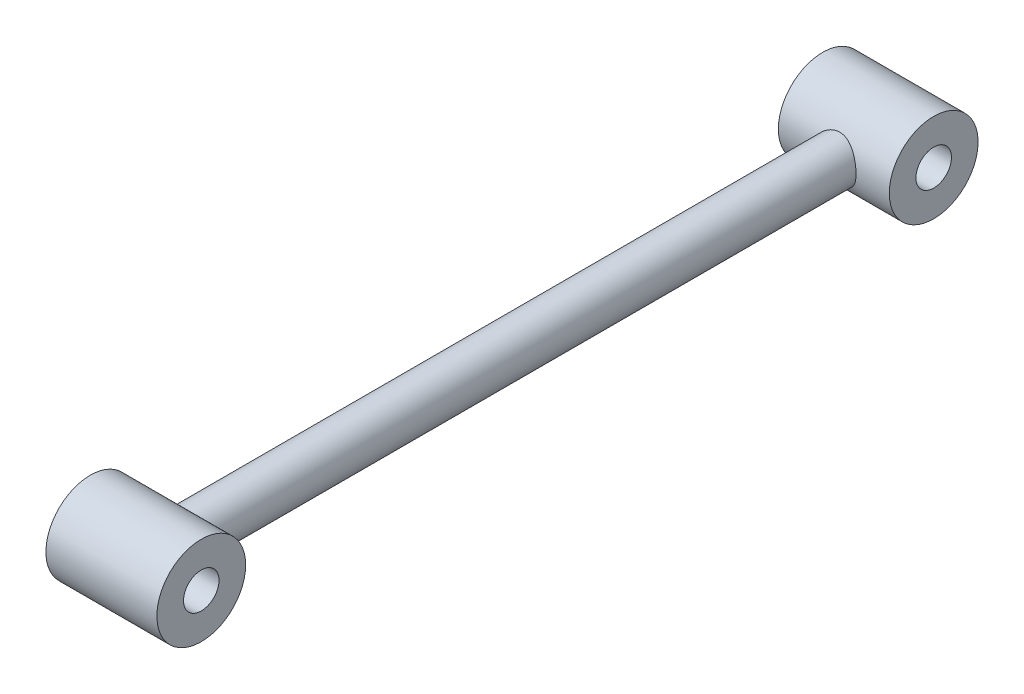
ISO-10303-21;
HEADER;
FILE_DESCRIPTION(('STEP AP214'),'2;1');
FILE_NAME('part.step','',(''),(''),'','','');
FILE_SCHEMA(('AUTOMOTIVE_DESIGN { 1 0 10303 214 1 1 1 1 }'));
ENDSEC;
DATA;
#1=APPLICATION_CONTEXT('core data for automotive mechanical design processes');
#2=APPLICATION_PROTOCOL_DEFINITION('international standard','automotive_design',2000,#1);
#3=PRODUCT_CONTEXT('',#1,'mechanical');
#4=PRODUCT('Part','Part','',(#3));
#5=PRODUCT_RELATED_PRODUCT_CATEGORY('part','',(#4));
#6=PRODUCT_DEFINITION_FORMATION('','',#4);
#7=PRODUCT_DEFINITION_CONTEXT('part definition',#1,'design');
#8=PRODUCT_DEFINITION('design','',#6,#7);
#9=PRODUCT_DEFINITION_SHAPE('','',#8);
#10=(LENGTH_UNIT() NAMED_UNIT(*) SI_UNIT(.MILLI.,.METRE.));
#11=(NAMED_UNIT(*) PLANE_ANGLE_UNIT() SI_UNIT($,.RADIAN.));
#12=(NAMED_UNIT(*) SI_UNIT($,.STERADIAN.) SOLID_ANGLE_UNIT());
#13=UNCERTAINTY_MEASURE_WITH_UNIT(LENGTH_MEASURE(1.E-05),#10,'distance_accuracy_value','');
#14=(GEOMETRIC_REPRESENTATION_CONTEXT(3) GLOBAL_UNCERTAINTY_ASSIGNED_CONTEXT((#13)) GLOBAL_UNIT_ASSIGNED_CONTEXT((#10,
#11,#12)) REPRESENTATION_CONTEXT('',''));
#15=CARTESIAN_POINT('',(0.,0.,0.));
#16=DIRECTION('',(0.,0.,1.));
#17=DIRECTION('',(1.,0.,0.));
#18=AXIS2_PLACEMENT_3D('',#15,#16,#17);
#19=CARTESIAN_POINT('',(0.,0.,165.));
#20=DIRECTION('',(0.,0.,-1.));
#21=DIRECTION('',(-1.,0.,0.));
#22=AXIS2_PLACEMENT_3D('',#19,#20,#21);
#23=CYLINDRICAL_SURFACE('',#22,5.);
#24=CARTESIAN_POINT('',(-5.,0.,10.));
#25=CARTESIAN_POINT('',(-4.99999956778397,-0.131488890078729,9.99999960171886));
#26=CARTESIAN_POINT('',(-4.99480722471488,-0.262986970217151,9.99740053121285));
#27=CARTESIAN_POINT('',(-4.97409710588797,-0.525014586348056,9.98706977835169));
#28=CARTESIAN_POINT('',(-4.95857483823602,-0.655543676003294,9.97933586314932));
#29=CARTESIAN_POINT('',(-4.91735922052266,-0.914783203431133,9.95892066969003));
#30=CARTESIAN_POINT('',(-4.89165136559376,-1.04349077535257,9.94623233642882));
#31=CARTESIAN_POINT('',(-4.83034932743654,-1.29802636754293,9.91622716576672));
#32=CARTESIAN_POINT('',(-4.79475110259437,-1.42385318781692,9.89890843630384));
#33=CARTESIAN_POINT('',(-4.7142215175487,-1.67121386584967,9.86015430154805));
#34=CARTESIAN_POINT('',(-4.66933135145195,-1.79276399094561,9.83873709670759));
#35=CARTESIAN_POINT('',(-4.57055120219305,-2.0314444775119,9.79224427489325));
#36=CARTESIAN_POINT('',(-4.51665783180655,-2.14857315511665,9.76716728146841));
#37=CARTESIAN_POINT('',(-4.34220037106102,-2.49222561412914,9.68730860488737));
#38=CARTESIAN_POINT('',(-4.20876922675994,-2.71128846115304,9.62785460216171));
#39=CARTESIAN_POINT('',(-3.90239471875545,-3.13758045755123,9.49780663424162));
#40=CARTESIAN_POINT('',(-3.72754930972028,-3.34329192972867,9.42675632671348));
#41=CARTESIAN_POINT('',(-3.34741091171685,-3.72388133818108,9.28300214475255));
#42=CARTESIAN_POINT('',(-3.14209493801615,-3.89873577832563,9.21029705743544));
#43=CARTESIAN_POINT('',(-2.68752485253572,-4.22628385620054,9.06493867332994));
#44=CARTESIAN_POINT('',(-2.43609810868252,-4.37620734766694,8.99272664170302));
#45=CARTESIAN_POINT('',(-2.04008195563241,-4.56723365243868,8.89637417546678));
#46=CARTESIAN_POINT('',(-1.90488170943973,-4.62527981130997,8.8662427968472));
#47=CARTESIAN_POINT('',(-1.62899874822594,-4.72948843578256,8.81109611627223));
#48=CARTESIAN_POINT('',(-1.48831933636083,-4.77565793744269,8.78607778701963));
#49=CARTESIAN_POINT('',(-1.21100724584403,-4.8531380584616,8.74350562362059));
#50=CARTESIAN_POINT('',(-1.07462952002207,-4.88516762296958,8.72559704108877));
#51=CARTESIAN_POINT('',(-0.799074302520378,-4.93772573892405,8.69596333711107));
#52=CARTESIAN_POINT('',(-0.659898336993894,-4.95826039236648,8.68423493515242));
#53=CARTESIAN_POINT('',(-0.379992538888764,-4.98752398958936,8.66746161087016));
#54=CARTESIAN_POINT('',(-0.239263693685896,-4.99626004329765,8.66241266349289));
#55=CARTESIAN_POINT('',(0.0425011762896065,-5.00180399494054,8.65921299638946));
#56=CARTESIAN_POINT('',(0.18353717047138,-4.99861303092503,8.6610616185123));
#57=CARTESIAN_POINT('',(0.447703572876951,-4.98145803092846,8.67093727173594));
#58=CARTESIAN_POINT('',(0.570952602810202,-4.96883208371091,8.67819663501131));
#59=CARTESIAN_POINT('',(0.815821213967111,-4.93454402662215,8.69773906996624));
#60=CARTESIAN_POINT('',(0.937440271021948,-4.91287907868334,8.71002371946269));
#61=CARTESIAN_POINT('',(1.17819787431277,-4.86076278292653,8.7392147957695));
#62=CARTESIAN_POINT('',(1.29733672485003,-4.83031251988904,8.75612065195562));
#63=CARTESIAN_POINT('',(1.5324713769544,-4.76094319159973,8.79403073984607));
#64=CARTESIAN_POINT('',(1.64846592327607,-4.72202079856857,8.81503658165343));
#65=CARTESIAN_POINT('',(1.99600687161863,-4.59108661358501,8.88436032421637));
#66=CARTESIAN_POINT('',(2.22169335603786,-4.48608785825886,8.93828791833522));
#67=CARTESIAN_POINT('',(2.65321011822285,-4.24519591002764,9.05517433078603));
#68=CARTESIAN_POINT('',(2.85903141775921,-4.10928884013355,9.11813720101033));
#69=CARTESIAN_POINT('',(3.27258852820379,-3.79034422310328,9.25565455759081));
#70=CARTESIAN_POINT('',(3.4772580077073,-3.60351571642877,9.33066654203131));
#71=CARTESIAN_POINT('',(3.85370346568872,-3.19773444843253,9.47739013910052));
#72=CARTESIAN_POINT('',(4.02546372382122,-2.97876642220598,9.54910016205802));
#73=CARTESIAN_POINT('',(4.25844089711319,-2.62430600098781,9.65034506582223));
#74=CARTESIAN_POINT('',(4.33335209514551,-2.49871002336159,9.68370380274257));
#75=CARTESIAN_POINT('',(4.47220820297243,-2.2407106014256,9.74663052718474));
#76=CARTESIAN_POINT('',(4.53615773559115,-2.1083100575541,9.77620011135784));
#77=CARTESIAN_POINT('',(4.65239887538339,-1.83762803314804,9.83067553510547));
#78=CARTESIAN_POINT('',(4.70469517552479,-1.69934894682179,9.85558325144947));
#79=CARTESIAN_POINT('',(4.79702492907996,-1.41791187896084,9.89999026457504));
#80=CARTESIAN_POINT('',(4.83705979318215,-1.27475446078987,9.91949018350379));
#81=CARTESIAN_POINT('',(4.90153356350301,-0.996798015430413,9.95109597328193));
#82=CARTESIAN_POINT('',(4.92698951540243,-0.862288674029799,9.96368046334327));
#83=CARTESIAN_POINT('',(4.9668080412236,-0.591248360012468,9.98343035732269));
#84=CARTESIAN_POINT('',(4.98117159579009,-0.454717567193954,9.99059624028199));
#85=CARTESIAN_POINT('',(4.99861316203406,-0.180810709359649,9.99930380487356));
#86=CARTESIAN_POINT('',(5.00169549426692,-0.0434349881359015,10.000847639673));
#87=CARTESIAN_POINT('',(4.99654442608125,0.231047608581549,9.9982723785904));
#88=CARTESIAN_POINT('',(4.98831152645069,0.368154495704338,9.99415353332645));
#89=CARTESIAN_POINT('',(4.96172132615896,0.630324023952244,9.98090973082446));
#90=CARTESIAN_POINT('',(4.94420162240662,0.755493751243217,9.97219922243106));
#91=CARTESIAN_POINT('',(4.89982552642939,1.00380426086804,9.95027227352717));
#92=CARTESIAN_POINT('',(4.87296617690675,1.12694438760008,9.93705440583579));
#93=CARTESIAN_POINT('',(4.81019731663748,1.37032307172126,9.90642450404115));
#94=CARTESIAN_POINT('',(4.77429057532187,1.49056250470176,9.88901375346269));
#95=CARTESIAN_POINT('',(4.69377183867682,1.72747946867538,9.85039368148874));
#96=CARTESIAN_POINT('',(4.64915650864734,1.84415561535681,9.8291829052407));
#97=CARTESIAN_POINT('',(4.5000521931497,2.19430354472275,9.75922876416582));
#98=CARTESIAN_POINT('',(4.38205925821493,2.42111320848944,9.7050490447818));
#99=CARTESIAN_POINT('',(4.1144478067803,2.8523456015808,9.58719375745592));
#100=CARTESIAN_POINT('',(3.96481581800769,3.05675873773466,9.52351414776381));
#101=CARTESIAN_POINT('',(3.62121270896337,3.45882132675025,9.38541505392105));
#102=CARTESIAN_POINT('',(3.42433040824756,3.65383533419946,9.31055499361996));
#103=CARTESIAN_POINT('',(3.00032946286605,4.00930667677967,9.16310881759144));
#104=CARTESIAN_POINT('',(2.77319007600167,4.16974010650665,9.09052430437333));
#105=CARTESIAN_POINT('',(2.40750943377075,4.38466016919211,8.98785260582619));
#106=CARTESIAN_POINT('',(2.27814912545653,4.4532676226712,8.95395955241384));
#107=CARTESIAN_POINT('',(2.01310589922104,4.57918112262683,8.8902235241508));
#108=CARTESIAN_POINT('',(1.87742587962408,4.63649228788887,8.8603787168037));
#109=CARTESIAN_POINT('',(1.60072296467476,4.73913999074898,8.80590327365629));
#110=CARTESIAN_POINT('',(1.45970454424996,4.78448631442401,8.7812683799473));
#111=CARTESIAN_POINT('',(1.17330895717519,4.86265004333096,8.73822819098158));
#112=CARTESIAN_POINT('',(1.02793246917246,4.89546938847111,8.71982193121851));
#113=CARTESIAN_POINT('',(0.748235018464722,4.94553834792943,8.69151275671388));
#114=CARTESIAN_POINT('',(0.614192116880048,4.96397997433445,8.68096327035261));
#115=CARTESIAN_POINT('',(0.344714754302619,4.98993873206132,8.66606824539578));
#116=CARTESIAN_POINT('',(0.209280440604789,4.99745700797003,8.66172205679784));
#117=CARTESIAN_POINT('',(-0.0617569250046254,5.00145477351748,8.65941425656732));
#118=CARTESIAN_POINT('',(-0.197359900849616,4.99793814327598,8.66145040076355));
#119=CARTESIAN_POINT('',(-0.467585557947871,4.97992974203946,8.67181681785817));
#120=CARTESIAN_POINT('',(-0.602208279104532,4.96543842034336,8.68014683308829));
#121=CARTESIAN_POINT('',(-0.856560202159012,4.92759757627216,8.70167828744802));
#122=CARTESIAN_POINT('',(-0.976482559623928,4.90522766015,8.71433770908854));
#123=CARTESIAN_POINT('',(-1.21386119056747,4.85194376743193,8.74411599480517));
#124=CARTESIAN_POINT('',(-1.33131668933404,4.82102714868722,8.76123623781643));
#125=CARTESIAN_POINT('',(-1.6789171151129,4.71590306073959,8.81854231868726));
#126=CARTESIAN_POINT('',(-1.904456094986,4.62929708984156,8.8646881377113));
#127=CARTESIAN_POINT('',(-2.35316034231251,4.4190716467502,8.97142890954606));
#128=CARTESIAN_POINT('',(-2.57514807598935,4.29335633682031,9.0327863364739));
#129=CARTESIAN_POINT('',(-2.99636410959572,4.01075421010744,9.16176636495221));
#130=CARTESIAN_POINT('',(-3.19558048344417,3.85385117607732,9.22939221620457));
#131=CARTESIAN_POINT('',(-3.59070785847072,3.49102748964406,9.3731144460079));
#132=CARTESIAN_POINT('',(-3.78327601876762,3.28146736342599,9.44924162905913));
#133=CARTESIAN_POINT('',(-4.13133442118328,2.83072875767414,9.59389514971536));
#134=CARTESIAN_POINT('',(-4.28680467774357,2.58953334336126,9.66241737976038));
#135=CARTESIAN_POINT('',(-4.48863041452682,2.20753881885374,9.75419013375831));
#136=CARTESIAN_POINT('',(-4.55086707940638,2.0762551257027,9.78304209980294));
#137=CARTESIAN_POINT('',(-4.66393615612038,1.80799529933999,9.83614745234556));
#138=CARTESIAN_POINT('',(-4.71477417053061,1.67102200205151,9.86040309707971));
#139=CARTESIAN_POINT('',(-4.80434543836719,1.39269501068688,9.90354484128719));
#140=CARTESIAN_POINT('',(-4.84310509298771,1.25135162347081,9.92244264379386));
#141=CARTESIAN_POINT('',(-4.90813759626857,0.965237205795556,9.95434618112012));
#142=CARTESIAN_POINT('',(-4.93441807252703,0.820468326048372,9.96735551489676));
#143=CARTESIAN_POINT('',(-4.96947453199886,0.563041654408159,9.98476387878719));
#144=CARTESIAN_POINT('',(-4.98091175369202,0.450825809730024,9.99046741601667));
#145=CARTESIAN_POINT('',(-4.99617477825015,0.225742246050265,9.99808569986016));
#146=CARTESIAN_POINT('',(-5.00000037102885,0.112874509142188,10.000000341898));
#147=CARTESIAN_POINT('',(-5.,0.,10.));
#148=B_SPLINE_CURVE_WITH_KNOTS('',3,(#24,#25,#26,#27,#28,#29,#30,#31,#32,#33,#34,#35,#36,#37,
#38,#39,#40,#41,#42,#43,#44,#45,#46,#47,#48,#49,#50,#51,#52,#53,#54,#55,#56,#57,#58,#59,#60,#61,
#62,#63,#64,#65,#66,#67,#68,#69,#70,#71,#72,#73,#74,#75,#76,#77,#78,#79,#80,#81,#82,#83,#84,#85,
#86,#87,#88,#89,#90,#91,#92,#93,#94,#95,#96,#97,#98,#99,#100,#101,#102,#103,#104,#105,#106,#107,
#108,#109,#110,#111,#112,#113,#114,#115,#116,#117,#118,#119,#120,#121,#122,#123,#124,#125,#126,
#127,#128,#129,#130,#131,#132,#133,#134,#135,#136,#137,#138,#139,#140,#141,#142,#143,#144,#145,
#146,#147),.UNSPECIFIED.,.T.,.F.,(4,2,2,2,2,2,2,2,2,2,2,2,2,2,2,2,2,2,2,2,2,2,2,2,2,2,2,2,2,2,2,
2,2,2,2,2,2,2,2,2,2,2,2,2,2,2,2,2,2,2,2,2,2,2,2,2,2,2,2,2,2,4),(0.,0.39435529464989,
0.788882184037817,1.18397293369035,1.57922537181693,1.97276168530542,2.36644639154631,
3.15295441699266,3.98704440767527,4.821766802355,5.72122193562246,6.17125359989459,
6.62101803579305,7.04410338623952,7.46696393118358,7.88956954321097,8.31213483216671,
8.68401534897463,9.05601271689169,9.42796417149685,9.8000619899096,10.56083380205,
11.3219478566368,12.1795688603196,13.03759852356,13.4870830845772,13.9363776171859,
14.3854908824168,14.8345524573652,15.2464230691107,15.6582572644723,16.0699337163998,
16.4815919489941,16.8612200640511,17.240968493866,17.6206008225791,18.0003788066131,
18.7808755264614,19.5617052624835,20.4192132572739,21.2773121558255,21.7277011924366,
22.1778856687596,22.6277007885002,23.0774462222894,23.4840267197959,23.8905646113036,
24.2969595710184,24.703337894006,25.0708552370355,25.4384863225851,26.1732662495599,
26.9574126491567,27.7419678673239,28.6218519479817,29.5022089791541,29.9460734671028,
30.3897193096443,30.8323885049027,31.2747867798493,31.6133053554877,31.9518332743451),.UNSPECIFIED.);
#149=CARTESIAN_POINT('',(-5.,0.,10.));
#150=VERTEX_POINT('',#149);
#151=EDGE_CURVE('E45',#150,#150,#148,.T.);
#152=ORIENTED_EDGE('',*,*,#151,.T.);
#153=EDGE_LOOP('',(#152));
#154=FACE_BOUND('',#153,.T.);
#155=CARTESIAN_POINT('',(-5.,0.,155.));
#156=CARTESIAN_POINT('',(-4.99999956778397,0.131488890078729,155.000000398281));
#157=CARTESIAN_POINT('',(-4.99480722471488,0.262986970217151,155.002599468787));
#158=CARTESIAN_POINT('',(-4.97409710588797,0.525014586348056,155.012930221648));
#159=CARTESIAN_POINT('',(-4.95857483823602,0.655543676003295,155.020664136851));
#160=CARTESIAN_POINT('',(-4.91735922052266,0.914783203431134,155.04107933031));
#161=CARTESIAN_POINT('',(-4.89165136559376,1.04349077535257,155.053767663571));
#162=CARTESIAN_POINT('',(-4.83034932743654,1.29802636754293,155.083772834233));
#163=CARTESIAN_POINT('',(-4.79475110259437,1.42385318781692,155.101091563696));
#164=CARTESIAN_POINT('',(-4.7142215175487,1.67121386584967,155.139845698452));
#165=CARTESIAN_POINT('',(-4.66933135145195,1.79276399094562,155.161262903292));
#166=CARTESIAN_POINT('',(-4.57055120219305,2.0314444775119,155.207755725107));
#167=CARTESIAN_POINT('',(-4.51665783180655,2.14857315511666,155.232832718532));
#168=CARTESIAN_POINT('',(-4.34220037106102,2.49222561412914,155.312691395113));
#169=CARTESIAN_POINT('',(-4.20876922675994,2.71128846115304,155.372145397838));
#170=CARTESIAN_POINT('',(-3.90239471875545,3.13758045755124,155.502193365758));
#171=CARTESIAN_POINT('',(-3.72754930972029,3.34329192972867,155.573243673287));
#172=CARTESIAN_POINT('',(-3.34741091171685,3.72388133818107,155.716997855247));
#173=CARTESIAN_POINT('',(-3.14209493801615,3.89873577832562,155.789702942565));
#174=CARTESIAN_POINT('',(-2.68752485253572,4.22628385620054,155.93506132667));
#175=CARTESIAN_POINT('',(-2.43609810868252,4.37620734766693,156.007273358297));
#176=CARTESIAN_POINT('',(-2.04008195563241,4.56723365243868,156.103625824533));
#177=CARTESIAN_POINT('',(-1.90488170943973,4.62527981130997,156.133757203153));
#178=CARTESIAN_POINT('',(-1.62899874822593,4.72948843578257,156.188903883728));
#179=CARTESIAN_POINT('',(-1.48831933636082,4.77565793744269,156.21392221298));
#180=CARTESIAN_POINT('',(-1.21100724584402,4.8531380584616,156.256494376379));
#181=CARTESIAN_POINT('',(-1.07462952002206,4.88516762296958,156.274402958911));
#182=CARTESIAN_POINT('',(-0.799074302520372,4.93772573892405,156.304036662889));
#183=CARTESIAN_POINT('',(-0.659898336993889,4.95826039236648,156.315765064848));
#184=CARTESIAN_POINT('',(-0.37999253888876,4.98752398958936,156.33253838913));
#185=CARTESIAN_POINT('',(-0.239263693685894,4.99626004329765,156.337587336507));
#186=CARTESIAN_POINT('',(0.042501176289607,5.00180399494054,156.340787003611));
#187=CARTESIAN_POINT('',(0.183537170471381,4.99861303092503,156.338938381488));
#188=CARTESIAN_POINT('',(0.447703572876951,4.98145803092846,156.329062728264));
#189=CARTESIAN_POINT('',(0.5709526028102,4.96883208371091,156.321803364989));
#190=CARTESIAN_POINT('',(0.815821213967109,4.93454402662215,156.302260930034));
#191=CARTESIAN_POINT('',(0.937440271021948,4.91287907868334,156.289976280537));
#192=CARTESIAN_POINT('',(1.17819787431277,4.86076278292653,156.260785204231));
#193=CARTESIAN_POINT('',(1.29733672485003,4.83031251988904,156.243879348044));
#194=CARTESIAN_POINT('',(1.53247137695439,4.76094319159973,156.205969260154));
#195=CARTESIAN_POINT('',(1.64846592327607,4.72202079856857,156.184963418347));
#196=CARTESIAN_POINT('',(1.99600687161863,4.59108661358501,156.115639675784));
#197=CARTESIAN_POINT('',(2.22169335603786,4.48608785825886,156.061712081665));
#198=CARTESIAN_POINT('',(2.65321011822286,4.24519591002764,155.944825669214));
#199=CARTESIAN_POINT('',(2.85903141775921,4.10928884013355,155.88186279899));
#200=CARTESIAN_POINT('',(3.27258852820379,3.79034422310328,155.744345442409));
#201=CARTESIAN_POINT('',(3.4772580077073,3.60351571642877,155.669333457969));
#202=CARTESIAN_POINT('',(3.85370346568872,3.19773444843253,155.522609860899));
#203=CARTESIAN_POINT('',(4.02546372382122,2.97876642220598,155.450899837942));
#204=CARTESIAN_POINT('',(4.25844089711319,2.62430600098782,155.349654934178));
#205=CARTESIAN_POINT('',(4.33335209514551,2.49871002336159,155.316296197257));
#206=CARTESIAN_POINT('',(4.47220820297243,2.24071060142561,155.253369472815));
#207=CARTESIAN_POINT('',(4.53615773559115,2.1083100575541,155.223799888642));
#208=CARTESIAN_POINT('',(4.65239887538339,1.83762803314804,155.169324464895));
#209=CARTESIAN_POINT('',(4.70469517552479,1.69934894682179,155.144416748551));
#210=CARTESIAN_POINT('',(4.79702492907996,1.41791187896083,155.100009735425));
#211=CARTESIAN_POINT('',(4.83705979318215,1.27475446078987,155.080509816496));
#212=CARTESIAN_POINT('',(4.90153356350302,0.996798015430414,155.048904026718));
#213=CARTESIAN_POINT('',(4.92698951540243,0.862288674029799,155.036319536657));
#214=CARTESIAN_POINT('',(4.9668080412236,0.591248360012467,155.016569642677));
#215=CARTESIAN_POINT('',(4.98117159579009,0.454717567193953,155.009403759718));
#216=CARTESIAN_POINT('',(4.99861316203406,0.180810709359648,155.000696195126));
#217=CARTESIAN_POINT('',(5.00169549426692,0.0434349881359,154.999152360327));
#218=CARTESIAN_POINT('',(4.99654442608125,-0.231047608581551,155.00172762141));
#219=CARTESIAN_POINT('',(4.98831152645069,-0.36815449570434,155.005846466674));
#220=CARTESIAN_POINT('',(4.96172132615896,-0.630324023952245,155.019090269176));
#221=CARTESIAN_POINT('',(4.94420162240662,-0.755493751243218,155.027800777569));
#222=CARTESIAN_POINT('',(4.89982552642939,-1.00380426086804,155.049727726473));
#223=CARTESIAN_POINT('',(4.87296617690675,-1.12694438760008,155.062945594164));
#224=CARTESIAN_POINT('',(4.81019731663748,-1.37032307172126,155.093575495959));
#225=CARTESIAN_POINT('',(4.77429057532187,-1.49056250470176,155.110986246537));
#226=CARTESIAN_POINT('',(4.69377183867682,-1.72747946867538,155.149606318511));
#227=CARTESIAN_POINT('',(4.64915650864734,-1.84415561535682,155.170817094759));
#228=CARTESIAN_POINT('',(4.5000521931497,-2.19430354472275,155.240771235834));
#229=CARTESIAN_POINT('',(4.38205925821493,-2.42111320848944,155.294950955218));
#230=CARTESIAN_POINT('',(4.1144478067803,-2.8523456015808,155.412806242544));
#231=CARTESIAN_POINT('',(3.96481581800769,-3.05675873773467,155.476485852236));
#232=CARTESIAN_POINT('',(3.62121270896337,-3.45882132675025,155.614584946079));
#233=CARTESIAN_POINT('',(3.42433040824757,-3.65383533419945,155.68944500638));
#234=CARTESIAN_POINT('',(3.00032946286605,-4.00930667677967,155.836891182409));
#235=CARTESIAN_POINT('',(2.77319007600168,-4.16974010650665,155.909475695627));
#236=CARTESIAN_POINT('',(2.40750943377075,-4.38466016919211,156.012147394174));
#237=CARTESIAN_POINT('',(2.27814912545654,-4.45326762267119,156.046040447586));
#238=CARTESIAN_POINT('',(2.01310589922105,-4.57918112262683,156.109776475849));
#239=CARTESIAN_POINT('',(1.87742587962409,-4.63649228788886,156.139621283196));
#240=CARTESIAN_POINT('',(1.60072296467478,-4.73913999074898,156.194096726344));
#241=CARTESIAN_POINT('',(1.45970454424998,-4.784486314424,156.218731620053));
#242=CARTESIAN_POINT('',(1.1733089571752,-4.86265004333096,156.261771809018));
#243=CARTESIAN_POINT('',(1.02793246917247,-4.89546938847111,156.280178068782));
#244=CARTESIAN_POINT('',(0.748235018464733,-4.94553834792942,156.308487243286));
#245=CARTESIAN_POINT('',(0.614192116880058,-4.96397997433445,156.319036729647));
#246=CARTESIAN_POINT('',(0.344714754302628,-4.98993873206132,156.333931754604));
#247=CARTESIAN_POINT('',(0.209280440604797,-4.99745700797003,156.338277943202));
#248=CARTESIAN_POINT('',(-0.0617569250046183,-5.00145477351748,156.340585743433));
#249=CARTESIAN_POINT('',(-0.19735990084961,-4.99793814327599,156.338549599236));
#250=CARTESIAN_POINT('',(-0.467585557947866,-4.97992974203946,156.328183182142));
#251=CARTESIAN_POINT('',(-0.602208279104527,-4.96543842034336,156.319853166912));
#252=CARTESIAN_POINT('',(-0.856560202159006,-4.92759757627216,156.298321712552));
#253=CARTESIAN_POINT('',(-0.976482559623921,-4.90522766015,156.285662290911));
#254=CARTESIAN_POINT('',(-1.21386119056747,-4.85194376743194,156.255884005195));
#255=CARTESIAN_POINT('',(-1.33131668933403,-4.82102714868723,156.238763762184));
#256=CARTESIAN_POINT('',(-1.6789171151129,-4.71590306073959,156.181457681313));
#257=CARTESIAN_POINT('',(-1.904456094986,-4.62929708984156,156.135311862289));
#258=CARTESIAN_POINT('',(-2.35316034231251,-4.4190716467502,156.028571090454));
#259=CARTESIAN_POINT('',(-2.57514807598935,-4.29335633682031,155.967213663526));
#260=CARTESIAN_POINT('',(-2.99636410959572,-4.01075421010744,155.838233635048));
#261=CARTESIAN_POINT('',(-3.19558048344417,-3.85385117607732,155.770607783795));
#262=CARTESIAN_POINT('',(-3.59070785847072,-3.49102748964406,155.626885553992));
#263=CARTESIAN_POINT('',(-3.78327601876762,-3.28146736342598,155.550758370941));
#264=CARTESIAN_POINT('',(-4.13133442118328,-2.83072875767414,155.406104850285));
#265=CARTESIAN_POINT('',(-4.28680467774357,-2.58953334336126,155.33758262024));
#266=CARTESIAN_POINT('',(-4.48863041452682,-2.20753881885373,155.245809866242));
#267=CARTESIAN_POINT('',(-4.55086707940638,-2.0762551257027,155.216957900197));
#268=CARTESIAN_POINT('',(-4.66393615612038,-1.80799529933998,155.163852547654));
#269=CARTESIAN_POINT('',(-4.71477417053062,-1.67102200205151,155.13959690292));
#270=CARTESIAN_POINT('',(-4.80434543836719,-1.39269501068688,155.096455158713));
#271=CARTESIAN_POINT('',(-4.84310509298771,-1.25135162347081,155.077557356206));
#272=CARTESIAN_POINT('',(-4.90813759626857,-0.965237205795555,155.04565381888));
#273=CARTESIAN_POINT('',(-4.93441807252703,-0.820468326048371,155.032644485103));
#274=CARTESIAN_POINT('',(-4.96947453199886,-0.563041654408157,155.015236121213));
#275=CARTESIAN_POINT('',(-4.98091175369202,-0.450825809730023,155.009532583983));
#276=CARTESIAN_POINT('',(-4.99617477825015,-0.225742246050264,155.00191430014));
#277=CARTESIAN_POINT('',(-5.00000037102885,-0.112874509142187,154.999999658102));
#278=CARTESIAN_POINT('',(-5.,0.,155.));
#279=B_SPLINE_CURVE_WITH_KNOTS('',3,(#155,#156,#157,#158,#159,#160,#161,#162,#163,#164,#165,
#166,#167,#168,#169,#170,#171,#172,#173,#174,#175,#176,#177,#178,#179,#180,#181,#182,#183,#184,
#185,#186,#187,#188,#189,#190,#191,#192,#193,#194,#195,#196,#197,#198,#199,#200,#201,#202,#203,
#204,#205,#206,#207,#208,#209,#210,#211,#212,#213,#214,#215,#216,#217,#218,#219,#220,#221,#222,
#223,#224,#225,#226,#227,#228,#229,#230,#231,#232,#233,#234,#235,#236,#237,#238,#239,#240,#241,
#242,#243,#244,#245,#246,#247,#248,#249,#250,#251,#252,#253,#254,#255,#256,#257,#258,#259,#260,
#261,#262,#263,#264,#265,#266,#267,#268,#269,#270,#271,#272,#273,#274,#275,#276,#277,#278),
.UNSPECIFIED.,.T.,.F.,(4,2,2,2,2,2,2,2,2,2,2,2,2,2,2,2,2,2,2,2,2,2,2,2,2,2,2,2,2,2,2,2,2,2,2,2,
2,2,2,2,2,2,2,2,2,2,2,2,2,2,2,2,2,2,2,2,2,2,2,2,2,4),(0.,0.394355294649889,0.788882184037818,
1.18397293369035,1.57922537181693,1.97276168530542,2.36644639154632,3.15295441699266,
3.98704440767526,4.82176680235499,5.72122193562246,6.17125359989459,6.62101803579306,
7.04410338623953,7.46696393118359,7.88956954321097,8.3121348321667,8.68401534897462,
9.05601271689169,9.42796417149685,9.8000619899096,10.56083380205,11.3219478566368,
12.1795688603196,13.03759852356,13.4870830845772,13.9363776171859,14.3854908824168,
14.8345524573652,15.2464230691107,15.6582572644723,16.0699337163998,16.4815919489941,
16.8612200640511,17.240968493866,17.6206008225791,18.0003788066131,18.7808755264614,
19.5617052624835,20.4192132572739,21.2773121558255,21.7277011924365,22.1778856687596,
22.6277007885002,23.0774462222894,23.4840267197959,23.8905646113036,24.2969595710184,
24.703337894006,25.0708552370355,25.4384863225851,26.1732662495599,26.9574126491567,
27.7419678673239,28.6218519479817,29.5022089791541,29.9460734671028,30.3897193096443,
30.8323885049027,31.2747867798493,31.6133053554877,31.9518332743451),.UNSPECIFIED.);
#280=CARTESIAN_POINT('',(-5.,0.,155.));
#281=VERTEX_POINT('',#280);
#282=EDGE_CURVE('E10',#281,#281,#279,.T.);
#283=ORIENTED_EDGE('',*,*,#282,.T.);
#284=EDGE_LOOP('',(#283));
#285=FACE_BOUND('',#284,.T.);
#286=ADVANCED_FACE('F41',(#154,#285),#23,.T.);
#287=CARTESIAN_POINT('',(-12.5,0.,165.));
#288=DIRECTION('',(1.,0.,0.));
#289=DIRECTION('',(0.,0.,-1.));
#290=AXIS2_PLACEMENT_3D('',#287,#288,#289);
#291=CYLINDRICAL_SURFACE('',#290,10.);
#292=CARTESIAN_POINT('',(-12.5,0.,165.));
#293=DIRECTION('',(1.,0.,0.));
#294=DIRECTION('',(0.,0.,-1.));
#295=AXIS2_PLACEMENT_3D('',#292,#293,#294);
#296=CIRCLE('',#295,10.);
#297=CARTESIAN_POINT('',(-12.5,0.,155.));
#298=VERTEX_POINT('',#297);
#299=EDGE_CURVE('E54',#298,#298,#296,.T.);
#300=ORIENTED_EDGE('',*,*,#299,.T.);
#301=EDGE_LOOP('',(#300));
#302=FACE_BOUND('',#301,.T.);
#303=CARTESIAN_POINT('',(12.5,0.,165.));
#304=DIRECTION('',(1.,0.,0.));
#305=DIRECTION('',(0.,0.,-1.));
#306=AXIS2_PLACEMENT_3D('',#303,#304,#305);
#307=CIRCLE('',#306,10.);
#308=CARTESIAN_POINT('',(12.5,0.,155.));
#309=VERTEX_POINT('',#308);
#310=EDGE_CURVE('E114',#309,#309,#307,.T.);
#311=ORIENTED_EDGE('',*,*,#310,.F.);
#312=EDGE_LOOP('',(#311));
#313=FACE_BOUND('',#312,.T.);
#314=ORIENTED_EDGE('',*,*,#282,.F.);
#315=EDGE_LOOP('',(#314));
#316=FACE_BOUND('',#315,.T.);
#317=ADVANCED_FACE('F65',(#302,#313,#316),#291,.T.);
#318=CARTESIAN_POINT('',(-12.5,0.,165.));
#319=DIRECTION('',(1.,0.,0.));
#320=DIRECTION('',(0.,0.,-1.));
#321=AXIS2_PLACEMENT_3D('',#318,#319,#320);
#322=PLANE('',#321);
#323=CARTESIAN_POINT('',(-12.5,0.,165.));
#324=DIRECTION('',(1.,0.,0.));
#325=DIRECTION('',(0.,0.,-1.));
#326=AXIS2_PLACEMENT_3D('',#323,#324,#325);
#327=CIRCLE('',#326,3.99999999999999);
#328=CARTESIAN_POINT('',(-12.5,0.,161.));
#329=VERTEX_POINT('',#328);
#330=EDGE_CURVE('E59',#329,#329,#327,.T.);
#331=ORIENTED_EDGE('',*,*,#330,.T.);
#332=EDGE_LOOP('',(#331));
#333=FACE_BOUND('',#332,.T.);
#334=ORIENTED_EDGE('',*,*,#299,.F.);
#335=EDGE_LOOP('',(#334));
#336=FACE_BOUND('',#335,.T.);
#337=ADVANCED_FACE('F69',(#333,#336),#322,.F.);
#338=CARTESIAN_POINT('',(-12.5,0.,165.));
#339=DIRECTION('',(1.,0.,0.));
#340=DIRECTION('',(0.,0.,-1.));
#341=AXIS2_PLACEMENT_3D('',#338,#339,#340);
#342=CYLINDRICAL_SURFACE('',#341,3.99999999999999);
#343=ORIENTED_EDGE('',*,*,#330,.F.);
#344=EDGE_LOOP('',(#343));
#345=FACE_BOUND('',#344,.T.);
#346=CARTESIAN_POINT('',(12.5,0.,165.));
#347=DIRECTION('',(1.,0.,0.));
#348=DIRECTION('',(0.,0.,-1.));
#349=AXIS2_PLACEMENT_3D('',#346,#347,#348);
#350=CIRCLE('',#349,3.99999999999999);
#351=CARTESIAN_POINT('',(12.5,0.,161.));
#352=VERTEX_POINT('',#351);
#353=EDGE_CURVE('E109',#352,#352,#350,.T.);
#354=ORIENTED_EDGE('',*,*,#353,.T.);
#355=EDGE_LOOP('',(#354));
#356=FACE_BOUND('',#355,.T.);
#357=ADVANCED_FACE('F73',(#345,#356),#342,.F.);
#358=CARTESIAN_POINT('',(12.5,0.,165.));
#359=DIRECTION('',(1.,0.,0.));
#360=DIRECTION('',(0.,0.,-1.));
#361=AXIS2_PLACEMENT_3D('',#358,#359,#360);
#362=PLANE('',#361);
#363=ORIENTED_EDGE('',*,*,#310,.T.);
#364=EDGE_LOOP('',(#363));
#365=FACE_BOUND('',#364,.T.);
#366=ORIENTED_EDGE('',*,*,#353,.F.);
#367=EDGE_LOOP('',(#366));
#368=FACE_BOUND('',#367,.T.);
#369=ADVANCED_FACE('F77',(#365,#368),#362,.T.);
#370=CARTESIAN_POINT('',(-12.5,0.,0.));
#371=DIRECTION('',(1.,0.,0.));
#372=DIRECTION('',(0.,0.,-1.));
#373=AXIS2_PLACEMENT_3D('',#370,#371,#372);
#374=CYLINDRICAL_SURFACE('',#373,10.);
#375=CARTESIAN_POINT('',(-12.5,0.,0.));
#376=DIRECTION('',(1.,0.,0.));
#377=DIRECTION('',(0.,0.,1.));
#378=AXIS2_PLACEMENT_3D('',#375,#376,#377);
#379=CIRCLE('',#378,10.);
#380=CARTESIAN_POINT('',(-12.5,0.,10.));
#381=VERTEX_POINT('',#380);
#382=EDGE_CURVE('E143',#381,#381,#379,.T.);
#383=ORIENTED_EDGE('',*,*,#382,.T.);
#384=EDGE_LOOP('',(#383));
#385=FACE_BOUND('',#384,.T.);
#386=CARTESIAN_POINT('',(12.5,0.,0.));
#387=DIRECTION('',(1.,0.,0.));
#388=DIRECTION('',(0.,0.,1.));
#389=AXIS2_PLACEMENT_3D('',#386,#387,#388);
#390=CIRCLE('',#389,10.);
#391=CARTESIAN_POINT('',(12.5,0.,10.));
#392=VERTEX_POINT('',#391);
#393=EDGE_CURVE('E117',#392,#392,#390,.T.);
#394=ORIENTED_EDGE('',*,*,#393,.F.);
#395=EDGE_LOOP('',(#394));
#396=FACE_BOUND('',#395,.T.);
#397=ORIENTED_EDGE('',*,*,#151,.F.);
#398=EDGE_LOOP('',(#397));
#399=FACE_BOUND('',#398,.T.);
#400=ADVANCED_FACE('F81',(#385,#396,#399),#374,.T.);
#401=CARTESIAN_POINT('',(-12.5,0.,0.));
#402=DIRECTION('',(1.,0.,0.));
#403=DIRECTION('',(0.,0.,-1.));
#404=AXIS2_PLACEMENT_3D('',#401,#402,#403);
#405=CYLINDRICAL_SURFACE('',#404,3.99999999999999);
#406=CARTESIAN_POINT('',(-12.5,0.,0.));
#407=DIRECTION('',(1.,0.,0.));
#408=DIRECTION('',(0.,0.,1.));
#409=AXIS2_PLACEMENT_3D('',#406,#407,#408);
#410=CIRCLE('',#409,3.99999999999999);
#411=CARTESIAN_POINT('',(-12.5,0.,3.99999999999999));
#412=VERTEX_POINT('',#411);
#413=EDGE_CURVE('E123',#412,#412,#410,.T.);
#414=ORIENTED_EDGE('',*,*,#413,.F.);
#415=EDGE_LOOP('',(#414));
#416=FACE_BOUND('',#415,.T.);
#417=CARTESIAN_POINT('',(12.5,0.,0.));
#418=DIRECTION('',(1.,0.,0.));
#419=DIRECTION('',(0.,0.,1.));
#420=AXIS2_PLACEMENT_3D('',#417,#418,#419);
#421=CIRCLE('',#420,3.99999999999999);
#422=CARTESIAN_POINT('',(12.5,0.,3.99999999999999));
#423=VERTEX_POINT('',#422);
#424=EDGE_CURVE('E110',#423,#423,#421,.T.);
#425=ORIENTED_EDGE('',*,*,#424,.T.);
#426=EDGE_LOOP('',(#425));
#427=FACE_BOUND('',#426,.T.);
#428=ADVANCED_FACE('F88',(#416,#427),#405,.F.);
#429=CARTESIAN_POINT('',(-12.5,0.,0.));
#430=DIRECTION('',(-1.,0.,0.));
#431=DIRECTION('',(0.,0.,1.));
#432=AXIS2_PLACEMENT_3D('',#429,#430,#431);
#433=PLANE('',#432);
#434=ORIENTED_EDGE('',*,*,#413,.T.);
#435=EDGE_LOOP('',(#434));
#436=FACE_BOUND('',#435,.T.);
#437=ORIENTED_EDGE('',*,*,#382,.F.);
#438=EDGE_LOOP('',(#437));
#439=FACE_BOUND('',#438,.T.);
#440=ADVANCED_FACE('F86',(#436,#439),#433,.T.);
#441=CARTESIAN_POINT('',(12.5,0.,0.));
#442=DIRECTION('',(-1.,0.,0.));
#443=DIRECTION('',(0.,0.,1.));
#444=AXIS2_PLACEMENT_3D('',#441,#442,#443);
#445=PLANE('',#444);
#446=ORIENTED_EDGE('',*,*,#393,.T.);
#447=EDGE_LOOP('',(#446));
#448=FACE_BOUND('',#447,.T.);
#449=ORIENTED_EDGE('',*,*,#424,.F.);
#450=EDGE_LOOP('',(#449));
#451=FACE_BOUND('',#450,.T.);
#452=ADVANCED_FACE('F83',(#448,#451),#445,.F.);
#453=CLOSED_SHELL('',(#286,#317,#337,#357,#369,#400,#428,#440,#452));
#454=MANIFOLD_SOLID_BREP('B2',#453);
#455=ADVANCED_BREP_SHAPE_REPRESENTATION('',(#18,#454),#14);
#456=SHAPE_DEFINITION_REPRESENTATION(#9,#455);
ENDSEC;
END-ISO-10303-21;
